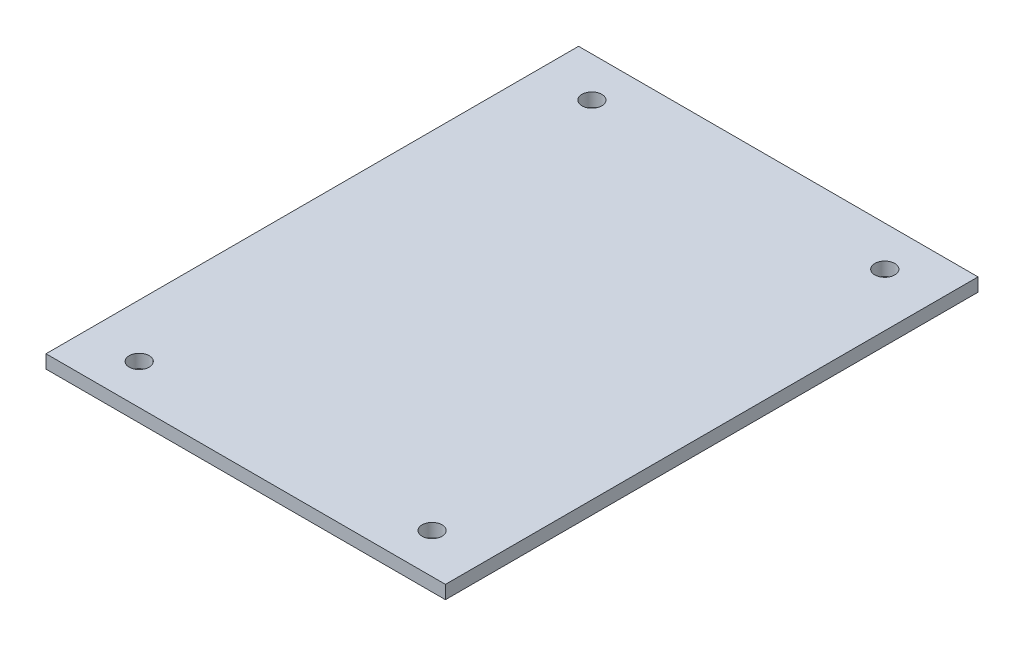
ISO-10303-21;
HEADER;
FILE_DESCRIPTION(('STEP AP214'),'2;1');
FILE_NAME('part.step','',(''),(''),'','','');
FILE_SCHEMA(('AUTOMOTIVE_DESIGN { 1 0 10303 214 1 1 1 1 }'));
ENDSEC;
DATA;
#1=APPLICATION_CONTEXT('core data for automotive mechanical design processes');
#2=APPLICATION_PROTOCOL_DEFINITION('international standard','automotive_design',2000,#1);
#3=PRODUCT_CONTEXT('',#1,'mechanical');
#4=PRODUCT('Part','Part','',(#3));
#5=PRODUCT_RELATED_PRODUCT_CATEGORY('part','',(#4));
#6=PRODUCT_DEFINITION_FORMATION('','',#4);
#7=PRODUCT_DEFINITION_CONTEXT('part definition',#1,'design');
#8=PRODUCT_DEFINITION('design','',#6,#7);
#9=PRODUCT_DEFINITION_SHAPE('','',#8);
#10=(LENGTH_UNIT() NAMED_UNIT(*) SI_UNIT(.MILLI.,.METRE.));
#11=(NAMED_UNIT(*) PLANE_ANGLE_UNIT() SI_UNIT($,.RADIAN.));
#12=(NAMED_UNIT(*) SI_UNIT($,.STERADIAN.) SOLID_ANGLE_UNIT());
#13=UNCERTAINTY_MEASURE_WITH_UNIT(LENGTH_MEASURE(1.E-05),#10,'distance_accuracy_value','');
#14=(GEOMETRIC_REPRESENTATION_CONTEXT(3) GLOBAL_UNCERTAINTY_ASSIGNED_CONTEXT((#13)) GLOBAL_UNIT_ASSIGNED_CONTEXT((#10,
#11,#12)) REPRESENTATION_CONTEXT('',''));
#15=CARTESIAN_POINT('',(0.,0.,0.));
#16=DIRECTION('',(0.,0.,1.));
#17=DIRECTION('',(1.,0.,0.));
#18=AXIS2_PLACEMENT_3D('',#15,#16,#17);
#19=CARTESIAN_POINT('',(38.1,2.54,-50.8));
#20=DIRECTION('',(-1.,0.,0.));
#21=DIRECTION('',(0.,0.,1.));
#22=AXIS2_PLACEMENT_3D('',#19,#20,#21);
#23=PLANE('',#22);
#24=DIRECTION('',(0.,0.,-1.));
#25=VECTOR('',#24,1.);
#26=CARTESIAN_POINT('',(38.1,0.,-50.8));
#27=LINE('',#26,#25);
#28=CARTESIAN_POINT('',(38.1,0.,50.8));
#29=VERTEX_POINT('',#28);
#30=CARTESIAN_POINT('',(38.1,0.,-50.8));
#31=VERTEX_POINT('',#30);
#32=EDGE_CURVE('E98',#29,#31,#27,.T.);
#33=ORIENTED_EDGE('',*,*,#32,.T.);
#34=DIRECTION('',(0.,-1.,0.));
#35=VECTOR('',#34,1.);
#36=CARTESIAN_POINT('',(38.1,2.54,-50.8));
#37=LINE('',#36,#35);
#38=CARTESIAN_POINT('',(38.1,2.54,-50.8));
#39=VERTEX_POINT('',#38);
#40=EDGE_CURVE('E11',#39,#31,#37,.T.);
#41=ORIENTED_EDGE('',*,*,#40,.F.);
#42=DIRECTION('',(0.,0.,-1.));
#43=VECTOR('',#42,1.);
#44=CARTESIAN_POINT('',(38.1,2.54,-50.8));
#45=LINE('',#44,#43);
#46=CARTESIAN_POINT('',(38.1,2.54,50.8));
#47=VERTEX_POINT('',#46);
#48=EDGE_CURVE('E86',#47,#39,#45,.T.);
#49=ORIENTED_EDGE('',*,*,#48,.F.);
#50=DIRECTION('',(0.,-1.,0.));
#51=VECTOR('',#50,1.);
#52=CARTESIAN_POINT('',(38.1,2.54,50.8));
#53=LINE('',#52,#51);
#54=EDGE_CURVE('E94',#47,#29,#53,.T.);
#55=ORIENTED_EDGE('',*,*,#54,.T.);
#56=EDGE_LOOP('',(#33,#41,#49,#55));
#57=FACE_BOUND('',#56,.T.);
#58=ADVANCED_FACE('F35',(#57),#23,.F.);
#59=CARTESIAN_POINT('',(-38.1,2.54,-50.8));
#60=DIRECTION('',(0.,0.,1.));
#61=DIRECTION('',(1.,0.,0.));
#62=AXIS2_PLACEMENT_3D('',#59,#60,#61);
#63=PLANE('',#62);
#64=DIRECTION('',(-1.,0.,0.));
#65=VECTOR('',#64,1.);
#66=CARTESIAN_POINT('',(-38.1,0.,-50.8));
#67=LINE('',#66,#65);
#68=CARTESIAN_POINT('',(-38.1,0.,-50.8));
#69=VERTEX_POINT('',#68);
#70=EDGE_CURVE('E90',#31,#69,#67,.T.);
#71=ORIENTED_EDGE('',*,*,#70,.T.);
#72=DIRECTION('',(0.,-1.,0.));
#73=VECTOR('',#72,1.);
#74=CARTESIAN_POINT('',(-38.1,2.54,-50.8));
#75=LINE('',#74,#73);
#76=CARTESIAN_POINT('',(-38.1,2.54,-50.8));
#77=VERTEX_POINT('',#76);
#78=EDGE_CURVE('E43',#77,#69,#75,.T.);
#79=ORIENTED_EDGE('',*,*,#78,.F.);
#80=DIRECTION('',(-1.,0.,0.));
#81=VECTOR('',#80,1.);
#82=CARTESIAN_POINT('',(-38.1,2.54,-50.8));
#83=LINE('',#82,#81);
#84=EDGE_CURVE('E81',#39,#77,#83,.T.);
#85=ORIENTED_EDGE('',*,*,#84,.F.);
#86=ORIENTED_EDGE('',*,*,#40,.T.);
#87=EDGE_LOOP('',(#71,#79,#85,#86));
#88=FACE_BOUND('',#87,.T.);
#89=ADVANCED_FACE('F89',(#88),#63,.F.);
#90=CARTESIAN_POINT('',(-38.1,2.54,-50.8));
#91=DIRECTION('',(1.,0.,0.));
#92=DIRECTION('',(0.,0.,-1.));
#93=AXIS2_PLACEMENT_3D('',#90,#91,#92);
#94=PLANE('',#93);
#95=DIRECTION('',(0.,0.,1.));
#96=VECTOR('',#95,1.);
#97=CARTESIAN_POINT('',(-38.1,0.,-50.8));
#98=LINE('',#97,#96);
#99=CARTESIAN_POINT('',(-38.1,0.,50.8));
#100=VERTEX_POINT('',#99);
#101=EDGE_CURVE('E68',#69,#100,#98,.T.);
#102=ORIENTED_EDGE('',*,*,#101,.T.);
#103=DIRECTION('',(0.,-1.,0.));
#104=VECTOR('',#103,1.);
#105=CARTESIAN_POINT('',(-38.1,2.54,50.8));
#106=LINE('',#105,#104);
#107=CARTESIAN_POINT('',(-38.1,2.54,50.8));
#108=VERTEX_POINT('',#107);
#109=EDGE_CURVE('E91',#108,#100,#106,.T.);
#110=ORIENTED_EDGE('',*,*,#109,.F.);
#111=DIRECTION('',(0.,0.,1.));
#112=VECTOR('',#111,1.);
#113=CARTESIAN_POINT('',(-38.1,2.54,-50.8));
#114=LINE('',#113,#112);
#115=EDGE_CURVE('E84',#77,#108,#114,.T.);
#116=ORIENTED_EDGE('',*,*,#115,.F.);
#117=ORIENTED_EDGE('',*,*,#78,.T.);
#118=EDGE_LOOP('',(#102,#110,#116,#117));
#119=FACE_BOUND('',#118,.T.);
#120=ADVANCED_FACE('F92',(#119),#94,.F.);
#121=CARTESIAN_POINT('',(-38.1,2.54,50.8));
#122=DIRECTION('',(0.,0.,-1.));
#123=DIRECTION('',(-1.,0.,0.));
#124=AXIS2_PLACEMENT_3D('',#121,#122,#123);
#125=PLANE('',#124);
#126=DIRECTION('',(1.,0.,0.));
#127=VECTOR('',#126,1.);
#128=CARTESIAN_POINT('',(-38.1,0.,50.8));
#129=LINE('',#128,#127);
#130=EDGE_CURVE('E74',#100,#29,#129,.T.);
#131=ORIENTED_EDGE('',*,*,#130,.T.);
#132=ORIENTED_EDGE('',*,*,#54,.F.);
#133=DIRECTION('',(1.,0.,0.));
#134=VECTOR('',#133,1.);
#135=CARTESIAN_POINT('',(-38.1,2.54,50.8));
#136=LINE('',#135,#134);
#137=EDGE_CURVE('E51',#108,#47,#136,.T.);
#138=ORIENTED_EDGE('',*,*,#137,.F.);
#139=ORIENTED_EDGE('',*,*,#109,.T.);
#140=EDGE_LOOP('',(#131,#132,#138,#139));
#141=FACE_BOUND('',#140,.T.);
#142=ADVANCED_FACE('F106',(#141),#125,.F.);
#143=CARTESIAN_POINT('',(0.,2.54,0.));
#144=DIRECTION('',(0.,1.,0.));
#145=DIRECTION('',(0.,0.,1.));
#146=AXIS2_PLACEMENT_3D('',#143,#144,#145);
#147=PLANE('',#146);
#148=CARTESIAN_POINT('',(27.94,2.54,-43.18));
#149=DIRECTION('',(0.,1.,0.));
#150=DIRECTION('',(0.,0.,1.));
#151=AXIS2_PLACEMENT_3D('',#148,#149,#150);
#152=CIRCLE('',#151,1.905);
#153=CARTESIAN_POINT('',(27.94,2.54,-41.275));
#154=VERTEX_POINT('',#153);
#155=EDGE_CURVE('E125',#154,#154,#152,.T.);
#156=ORIENTED_EDGE('',*,*,#155,.F.);
#157=EDGE_LOOP('',(#156));
#158=FACE_BOUND('',#157,.T.);
#159=CARTESIAN_POINT('',(-27.94,2.54,43.18));
#160=DIRECTION('',(0.,1.,0.));
#161=DIRECTION('',(0.,0.,1.));
#162=AXIS2_PLACEMENT_3D('',#159,#160,#161);
#163=CIRCLE('',#162,1.905);
#164=CARTESIAN_POINT('',(-27.94,2.54,45.085));
#165=VERTEX_POINT('',#164);
#166=EDGE_CURVE('E118',#165,#165,#163,.T.);
#167=ORIENTED_EDGE('',*,*,#166,.F.);
#168=EDGE_LOOP('',(#167));
#169=FACE_BOUND('',#168,.T.);
#170=CARTESIAN_POINT('',(27.94,2.54,43.18));
#171=DIRECTION('',(0.,1.,0.));
#172=DIRECTION('',(0.,0.,1.));
#173=AXIS2_PLACEMENT_3D('',#170,#171,#172);
#174=CIRCLE('',#173,1.905);
#175=CARTESIAN_POINT('',(27.94,2.54,45.085));
#176=VERTEX_POINT('',#175);
#177=EDGE_CURVE('E130',#176,#176,#174,.T.);
#178=ORIENTED_EDGE('',*,*,#177,.F.);
#179=EDGE_LOOP('',(#178));
#180=FACE_BOUND('',#179,.T.);
#181=CARTESIAN_POINT('',(-27.94,2.54,-43.18));
#182=DIRECTION('',(0.,1.,0.));
#183=DIRECTION('',(0.,0.,1.));
#184=AXIS2_PLACEMENT_3D('',#181,#182,#183);
#185=CIRCLE('',#184,1.905);
#186=CARTESIAN_POINT('',(-27.94,2.54,-41.275));
#187=VERTEX_POINT('',#186);
#188=EDGE_CURVE('E112',#187,#187,#185,.T.);
#189=ORIENTED_EDGE('',*,*,#188,.F.);
#190=EDGE_LOOP('',(#189));
#191=FACE_BOUND('',#190,.T.);
#192=ORIENTED_EDGE('',*,*,#48,.T.);
#193=ORIENTED_EDGE('',*,*,#84,.T.);
#194=ORIENTED_EDGE('',*,*,#115,.T.);
#195=ORIENTED_EDGE('',*,*,#137,.T.);
#196=EDGE_LOOP('',(#192,#193,#194,#195));
#197=FACE_BOUND('',#196,.T.);
#198=ADVANCED_FACE('F82',(#158,#169,#180,#191,#197),#147,.T.);
#199=CARTESIAN_POINT('',(0.,0.,0.));
#200=DIRECTION('',(0.,1.,0.));
#201=DIRECTION('',(0.,0.,1.));
#202=AXIS2_PLACEMENT_3D('',#199,#200,#201);
#203=PLANE('',#202);
#204=CARTESIAN_POINT('',(27.94,0.,-43.18));
#205=DIRECTION('',(0.,1.,0.));
#206=DIRECTION('',(0.,0.,1.));
#207=AXIS2_PLACEMENT_3D('',#204,#205,#206);
#208=CIRCLE('',#207,1.905);
#209=CARTESIAN_POINT('',(27.94,0.,-41.275));
#210=VERTEX_POINT('',#209);
#211=EDGE_CURVE('E115',#210,#210,#208,.T.);
#212=ORIENTED_EDGE('',*,*,#211,.T.);
#213=EDGE_LOOP('',(#212));
#214=FACE_BOUND('',#213,.T.);
#215=CARTESIAN_POINT('',(-27.94,0.,43.18));
#216=DIRECTION('',(0.,1.,0.));
#217=DIRECTION('',(0.,0.,1.));
#218=AXIS2_PLACEMENT_3D('',#215,#216,#217);
#219=CIRCLE('',#218,1.905);
#220=CARTESIAN_POINT('',(-27.94,0.,45.085));
#221=VERTEX_POINT('',#220);
#222=EDGE_CURVE('E121',#221,#221,#219,.T.);
#223=ORIENTED_EDGE('',*,*,#222,.T.);
#224=EDGE_LOOP('',(#223));
#225=FACE_BOUND('',#224,.T.);
#226=CARTESIAN_POINT('',(27.94,0.,43.18));
#227=DIRECTION('',(0.,1.,0.));
#228=DIRECTION('',(0.,0.,1.));
#229=AXIS2_PLACEMENT_3D('',#226,#227,#228);
#230=CIRCLE('',#229,1.905);
#231=CARTESIAN_POINT('',(27.94,0.,45.085));
#232=VERTEX_POINT('',#231);
#233=EDGE_CURVE('E122',#232,#232,#230,.T.);
#234=ORIENTED_EDGE('',*,*,#233,.T.);
#235=EDGE_LOOP('',(#234));
#236=FACE_BOUND('',#235,.T.);
#237=CARTESIAN_POINT('',(-27.94,0.,-43.18));
#238=DIRECTION('',(0.,1.,0.));
#239=DIRECTION('',(0.,0.,1.));
#240=AXIS2_PLACEMENT_3D('',#237,#238,#239);
#241=CIRCLE('',#240,1.905);
#242=CARTESIAN_POINT('',(-27.94,0.,-41.275));
#243=VERTEX_POINT('',#242);
#244=EDGE_CURVE('E101',#243,#243,#241,.T.);
#245=ORIENTED_EDGE('',*,*,#244,.T.);
#246=EDGE_LOOP('',(#245));
#247=FACE_BOUND('',#246,.T.);
#248=ORIENTED_EDGE('',*,*,#32,.F.);
#249=ORIENTED_EDGE('',*,*,#130,.F.);
#250=ORIENTED_EDGE('',*,*,#101,.F.);
#251=ORIENTED_EDGE('',*,*,#70,.F.);
#252=EDGE_LOOP('',(#248,#249,#250,#251));
#253=FACE_BOUND('',#252,.T.);
#254=ADVANCED_FACE('F109',(#214,#225,#236,#247,#253),#203,.F.);
#255=CARTESIAN_POINT('',(-27.94,0.,-43.18));
#256=DIRECTION('',(0.,1.,0.));
#257=DIRECTION('',(0.,0.,1.));
#258=AXIS2_PLACEMENT_3D('',#255,#256,#257);
#259=CYLINDRICAL_SURFACE('',#258,1.905);
#260=ORIENTED_EDGE('',*,*,#244,.F.);
#261=EDGE_LOOP('',(#260));
#262=FACE_BOUND('',#261,.T.);
#263=ORIENTED_EDGE('',*,*,#188,.T.);
#264=EDGE_LOOP('',(#263));
#265=FACE_BOUND('',#264,.T.);
#266=ADVANCED_FACE('F142',(#262,#265),#259,.F.);
#267=CARTESIAN_POINT('',(27.94,0.,43.18));
#268=DIRECTION('',(0.,1.,0.));
#269=DIRECTION('',(0.,0.,1.));
#270=AXIS2_PLACEMENT_3D('',#267,#268,#269);
#271=CYLINDRICAL_SURFACE('',#270,1.905);
#272=ORIENTED_EDGE('',*,*,#233,.F.);
#273=EDGE_LOOP('',(#272));
#274=FACE_BOUND('',#273,.T.);
#275=ORIENTED_EDGE('',*,*,#177,.T.);
#276=EDGE_LOOP('',(#275));
#277=FACE_BOUND('',#276,.T.);
#278=ADVANCED_FACE('F138',(#274,#277),#271,.F.);
#279=CARTESIAN_POINT('',(-27.94,0.,43.18));
#280=DIRECTION('',(0.,1.,0.));
#281=DIRECTION('',(0.,0.,1.));
#282=AXIS2_PLACEMENT_3D('',#279,#280,#281);
#283=CYLINDRICAL_SURFACE('',#282,1.905);
#284=ORIENTED_EDGE('',*,*,#222,.F.);
#285=EDGE_LOOP('',(#284));
#286=FACE_BOUND('',#285,.T.);
#287=ORIENTED_EDGE('',*,*,#166,.T.);
#288=EDGE_LOOP('',(#287));
#289=FACE_BOUND('',#288,.T.);
#290=ADVANCED_FACE('F141',(#286,#289),#283,.F.);
#291=CARTESIAN_POINT('',(27.94,0.,-43.18));
#292=DIRECTION('',(0.,1.,0.));
#293=DIRECTION('',(0.,0.,1.));
#294=AXIS2_PLACEMENT_3D('',#291,#292,#293);
#295=CYLINDRICAL_SURFACE('',#294,1.905);
#296=ORIENTED_EDGE('',*,*,#211,.F.);
#297=EDGE_LOOP('',(#296));
#298=FACE_BOUND('',#297,.T.);
#299=ORIENTED_EDGE('',*,*,#155,.T.);
#300=EDGE_LOOP('',(#299));
#301=FACE_BOUND('',#300,.T.);
#302=ADVANCED_FACE('F203',(#298,#301),#295,.F.);
#303=CLOSED_SHELL('',(#58,#89,#120,#142,#198,#254,#266,#278,#290,#302));
#304=MANIFOLD_SOLID_BREP('B2',#303);
#305=ADVANCED_BREP_SHAPE_REPRESENTATION('',(#18,#304),#14);
#306=SHAPE_DEFINITION_REPRESENTATION(#9,#305);
ENDSEC;
END-ISO-10303-21;
